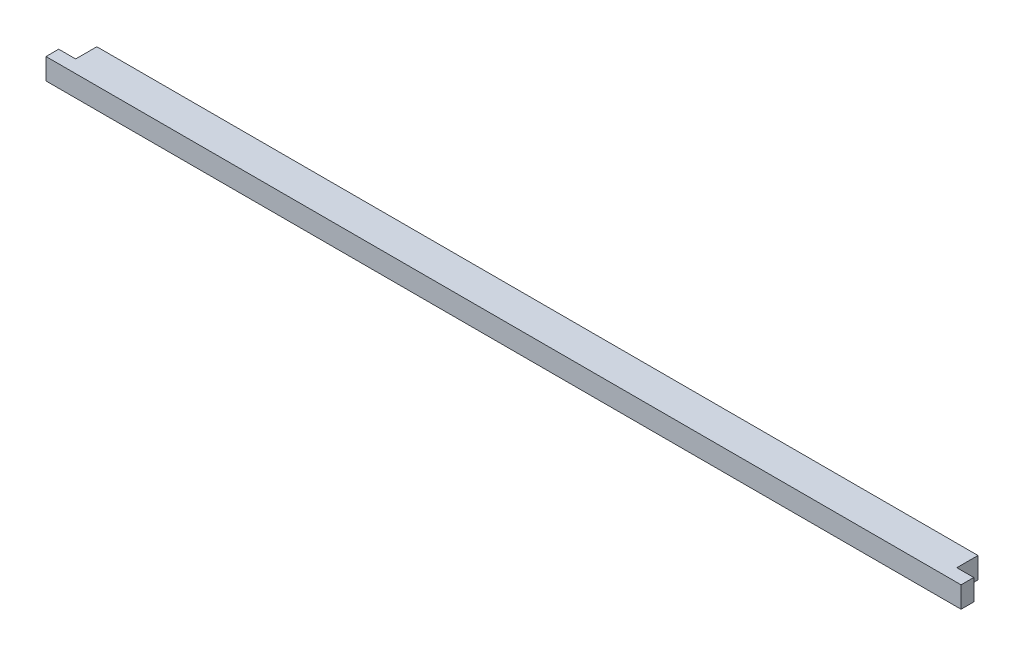
ISO-10303-21;
HEADER;
FILE_DESCRIPTION(('STEP AP214'),'2;1');
FILE_NAME('part.step','',(''),(''),'','','');
FILE_SCHEMA(('AUTOMOTIVE_DESIGN { 1 0 10303 214 1 1 1 1 }'));
ENDSEC;
DATA;
#1=APPLICATION_CONTEXT('core data for automotive mechanical design processes');
#2=APPLICATION_PROTOCOL_DEFINITION('international standard','automotive_design',2000,#1);
#3=PRODUCT_CONTEXT('',#1,'mechanical');
#4=PRODUCT('Part','Part','',(#3));
#5=PRODUCT_RELATED_PRODUCT_CATEGORY('part','',(#4));
#6=PRODUCT_DEFINITION_FORMATION('','',#4);
#7=PRODUCT_DEFINITION_CONTEXT('part definition',#1,'design');
#8=PRODUCT_DEFINITION('design','',#6,#7);
#9=PRODUCT_DEFINITION_SHAPE('','',#8);
#10=(LENGTH_UNIT() NAMED_UNIT(*) SI_UNIT(.MILLI.,.METRE.));
#11=(NAMED_UNIT(*) PLANE_ANGLE_UNIT() SI_UNIT($,.RADIAN.));
#12=(NAMED_UNIT(*) SI_UNIT($,.STERADIAN.) SOLID_ANGLE_UNIT());
#13=UNCERTAINTY_MEASURE_WITH_UNIT(LENGTH_MEASURE(1.E-05),#10,'distance_accuracy_value','');
#14=(GEOMETRIC_REPRESENTATION_CONTEXT(3) GLOBAL_UNCERTAINTY_ASSIGNED_CONTEXT((#13)) GLOBAL_UNIT_ASSIGNED_CONTEXT((#10,
#11,#12)) REPRESENTATION_CONTEXT('',''));
#15=CARTESIAN_POINT('',(0.,0.,0.));
#16=DIRECTION('',(0.,0.,1.));
#17=DIRECTION('',(1.,0.,0.));
#18=AXIS2_PLACEMENT_3D('',#15,#16,#17);
#19=CARTESIAN_POINT('',(0.,10.,-16.));
#20=DIRECTION('',(0.,0.,-1.));
#21=DIRECTION('',(-1.,0.,0.));
#22=AXIS2_PLACEMENT_3D('',#19,#20,#21);
#23=PLANE('',#22);
#24=DIRECTION('',(0.,1.,0.));
#25=VECTOR('',#24,1.);
#26=CARTESIAN_POINT('',(8.,0.,-16.));
#27=LINE('',#26,#25);
#28=CARTESIAN_POINT('',(8.,0.,-16.));
#29=VERTEX_POINT('',#28);
#30=CARTESIAN_POINT('',(8.,10.,-16.));
#31=VERTEX_POINT('',#30);
#32=EDGE_CURVE('E131',#29,#31,#27,.T.);
#33=ORIENTED_EDGE('',*,*,#32,.T.);
#34=DIRECTION('',(1.,0.,0.));
#35=VECTOR('',#34,1.);
#36=CARTESIAN_POINT('',(0.,10.,-16.));
#37=LINE('',#36,#35);
#38=CARTESIAN_POINT('',(424.,10.,-16.));
#39=VERTEX_POINT('',#38);
#40=EDGE_CURVE('E118',#31,#39,#37,.T.);
#41=ORIENTED_EDGE('',*,*,#40,.T.);
#42=DIRECTION('',(0.,1.,0.));
#43=VECTOR('',#42,1.);
#44=CARTESIAN_POINT('',(424.,0.,-16.));
#45=LINE('',#44,#43);
#46=CARTESIAN_POINT('',(424.,0.,-16.));
#47=VERTEX_POINT('',#46);
#48=EDGE_CURVE('E137',#47,#39,#45,.T.);
#49=ORIENTED_EDGE('',*,*,#48,.F.);
#50=DIRECTION('',(1.,0.,0.));
#51=VECTOR('',#50,1.);
#52=CARTESIAN_POINT('',(0.,0.,-16.));
#53=LINE('',#52,#51);
#54=EDGE_CURVE('E128',#29,#47,#53,.T.);
#55=ORIENTED_EDGE('',*,*,#54,.F.);
#56=EDGE_LOOP('',(#33,#41,#49,#55));
#57=FACE_BOUND('',#56,.T.);
#58=ADVANCED_FACE('F33',(#57),#23,.T.);
#59=CARTESIAN_POINT('',(0.,10.,0.));
#60=DIRECTION('',(-1.,0.,0.));
#61=DIRECTION('',(0.,0.,1.));
#62=AXIS2_PLACEMENT_3D('',#59,#60,#61);
#63=PLANE('',#62);
#64=DIRECTION('',(0.,1.,0.));
#65=VECTOR('',#64,1.);
#66=CARTESIAN_POINT('',(0.,0.,-6.));
#67=LINE('',#66,#65);
#68=CARTESIAN_POINT('',(0.,0.,-6.));
#69=VERTEX_POINT('',#68);
#70=CARTESIAN_POINT('',(0.,10.,-6.));
#71=VERTEX_POINT('',#70);
#72=EDGE_CURVE('E99',#69,#71,#67,.T.);
#73=ORIENTED_EDGE('',*,*,#72,.F.);
#74=DIRECTION('',(0.,0.,-1.));
#75=VECTOR('',#74,1.);
#76=CARTESIAN_POINT('',(0.,0.,0.));
#77=LINE('',#76,#75);
#78=CARTESIAN_POINT('',(0.,0.,0.));
#79=VERTEX_POINT('',#78);
#80=EDGE_CURVE('E110',#79,#69,#77,.T.);
#81=ORIENTED_EDGE('',*,*,#80,.F.);
#82=DIRECTION('',(0.,-1.,0.));
#83=VECTOR('',#82,1.);
#84=CARTESIAN_POINT('',(0.,10.,0.));
#85=LINE('',#84,#83);
#86=CARTESIAN_POINT('',(0.,10.,0.));
#87=VERTEX_POINT('',#86);
#88=EDGE_CURVE('E11',#87,#79,#85,.T.);
#89=ORIENTED_EDGE('',*,*,#88,.F.);
#90=DIRECTION('',(0.,0.,-1.));
#91=VECTOR('',#90,1.);
#92=CARTESIAN_POINT('',(0.,10.,0.));
#93=LINE('',#92,#91);
#94=EDGE_CURVE('E112',#87,#71,#93,.T.);
#95=ORIENTED_EDGE('',*,*,#94,.T.);
#96=EDGE_LOOP('',(#73,#81,#89,#95));
#97=FACE_BOUND('',#96,.T.);
#98=ADVANCED_FACE('F109',(#97),#63,.T.);
#99=CARTESIAN_POINT('',(0.,10.,0.));
#100=DIRECTION('',(0.,0.,-1.));
#101=DIRECTION('',(-1.,0.,0.));
#102=AXIS2_PLACEMENT_3D('',#99,#100,#101);
#103=PLANE('',#102);
#104=DIRECTION('',(1.,0.,0.));
#105=VECTOR('',#104,1.);
#106=CARTESIAN_POINT('',(0.,0.,0.));
#107=LINE('',#106,#105);
#108=CARTESIAN_POINT('',(432.,0.,0.));
#109=VERTEX_POINT('',#108);
#110=EDGE_CURVE('E117',#79,#109,#107,.T.);
#111=ORIENTED_EDGE('',*,*,#110,.T.);
#112=DIRECTION('',(0.,-1.,0.));
#113=VECTOR('',#112,1.);
#114=CARTESIAN_POINT('',(432.,10.,0.));
#115=LINE('',#114,#113);
#116=CARTESIAN_POINT('',(432.,10.,0.));
#117=VERTEX_POINT('',#116);
#118=EDGE_CURVE('E36',#117,#109,#115,.T.);
#119=ORIENTED_EDGE('',*,*,#118,.F.);
#120=DIRECTION('',(1.,0.,0.));
#121=VECTOR('',#120,1.);
#122=CARTESIAN_POINT('',(0.,10.,0.));
#123=LINE('',#122,#121);
#124=EDGE_CURVE('E133',#87,#117,#123,.T.);
#125=ORIENTED_EDGE('',*,*,#124,.F.);
#126=ORIENTED_EDGE('',*,*,#88,.T.);
#127=EDGE_LOOP('',(#111,#119,#125,#126));
#128=FACE_BOUND('',#127,.T.);
#129=ADVANCED_FACE('F178',(#128),#103,.F.);
#130=CARTESIAN_POINT('',(432.,10.,0.));
#131=DIRECTION('',(-1.,0.,0.));
#132=DIRECTION('',(0.,0.,1.));
#133=AXIS2_PLACEMENT_3D('',#130,#131,#132);
#134=PLANE('',#133);
#135=DIRECTION('',(0.,0.,-1.));
#136=VECTOR('',#135,1.);
#137=CARTESIAN_POINT('',(432.,0.,0.));
#138=LINE('',#137,#136);
#139=CARTESIAN_POINT('',(432.,0.,-6.));
#140=VERTEX_POINT('',#139);
#141=EDGE_CURVE('E123',#109,#140,#138,.T.);
#142=ORIENTED_EDGE('',*,*,#141,.T.);
#143=DIRECTION('',(0.,1.,0.));
#144=VECTOR('',#143,1.);
#145=CARTESIAN_POINT('',(432.,0.,-6.));
#146=LINE('',#145,#144);
#147=CARTESIAN_POINT('',(432.,10.,-6.));
#148=VERTEX_POINT('',#147);
#149=EDGE_CURVE('E141',#140,#148,#146,.T.);
#150=ORIENTED_EDGE('',*,*,#149,.T.);
#151=DIRECTION('',(0.,0.,-1.));
#152=VECTOR('',#151,1.);
#153=CARTESIAN_POINT('',(432.,10.,0.));
#154=LINE('',#153,#152);
#155=EDGE_CURVE('E121',#117,#148,#154,.T.);
#156=ORIENTED_EDGE('',*,*,#155,.F.);
#157=ORIENTED_EDGE('',*,*,#118,.T.);
#158=EDGE_LOOP('',(#142,#150,#156,#157));
#159=FACE_BOUND('',#158,.T.);
#160=ADVANCED_FACE('F173',(#159),#134,.F.);
#161=CARTESIAN_POINT('',(0.,10.,0.));
#162=DIRECTION('',(0.,1.,0.));
#163=DIRECTION('',(0.,0.,1.));
#164=AXIS2_PLACEMENT_3D('',#161,#162,#163);
#165=PLANE('',#164);
#166=DIRECTION('',(0.,0.,-1.));
#167=VECTOR('',#166,1.);
#168=CARTESIAN_POINT('',(8.,10.,-16.));
#169=LINE('',#168,#167);
#170=CARTESIAN_POINT('',(8.,10.,-6.));
#171=VERTEX_POINT('',#170);
#172=EDGE_CURVE('E104',#171,#31,#169,.T.);
#173=ORIENTED_EDGE('',*,*,#172,.F.);
#174=DIRECTION('',(1.,0.,0.));
#175=VECTOR('',#174,1.);
#176=CARTESIAN_POINT('',(0.,10.,-6.));
#177=LINE('',#176,#175);
#178=EDGE_CURVE('E144',#71,#171,#177,.T.);
#179=ORIENTED_EDGE('',*,*,#178,.F.);
#180=ORIENTED_EDGE('',*,*,#94,.F.);
#181=ORIENTED_EDGE('',*,*,#124,.T.);
#182=ORIENTED_EDGE('',*,*,#155,.T.);
#183=DIRECTION('',(1.,0.,0.));
#184=VECTOR('',#183,1.);
#185=CARTESIAN_POINT('',(424.,10.,-6.));
#186=LINE('',#185,#184);
#187=CARTESIAN_POINT('',(424.,10.,-6.));
#188=VERTEX_POINT('',#187);
#189=EDGE_CURVE('E145',#188,#148,#186,.T.);
#190=ORIENTED_EDGE('',*,*,#189,.F.);
#191=DIRECTION('',(0.,0.,1.));
#192=VECTOR('',#191,1.);
#193=CARTESIAN_POINT('',(424.,10.,-16.));
#194=LINE('',#193,#192);
#195=EDGE_CURVE('E148',#39,#188,#194,.T.);
#196=ORIENTED_EDGE('',*,*,#195,.F.);
#197=ORIENTED_EDGE('',*,*,#40,.F.);
#198=EDGE_LOOP('',(#173,#179,#180,#181,#182,#190,#196,#197));
#199=FACE_BOUND('',#198,.T.);
#200=ADVANCED_FACE('F169',(#199),#165,.T.);
#201=CARTESIAN_POINT('',(0.,0.,0.));
#202=DIRECTION('',(0.,1.,0.));
#203=DIRECTION('',(0.,0.,1.));
#204=AXIS2_PLACEMENT_3D('',#201,#202,#203);
#205=PLANE('',#204);
#206=DIRECTION('',(1.,0.,0.));
#207=VECTOR('',#206,1.);
#208=CARTESIAN_POINT('',(0.,0.,-6.));
#209=LINE('',#208,#207);
#210=CARTESIAN_POINT('',(8.,0.,-6.));
#211=VERTEX_POINT('',#210);
#212=EDGE_CURVE('E95',#69,#211,#209,.T.);
#213=ORIENTED_EDGE('',*,*,#212,.T.);
#214=DIRECTION('',(0.,0.,-1.));
#215=VECTOR('',#214,1.);
#216=CARTESIAN_POINT('',(8.,0.,-16.));
#217=LINE('',#216,#215);
#218=EDGE_CURVE('E47',#211,#29,#217,.T.);
#219=ORIENTED_EDGE('',*,*,#218,.T.);
#220=ORIENTED_EDGE('',*,*,#54,.T.);
#221=DIRECTION('',(0.,0.,1.));
#222=VECTOR('',#221,1.);
#223=CARTESIAN_POINT('',(424.,0.,-16.));
#224=LINE('',#223,#222);
#225=CARTESIAN_POINT('',(424.,0.,-6.));
#226=VERTEX_POINT('',#225);
#227=EDGE_CURVE('E147',#47,#226,#224,.T.);
#228=ORIENTED_EDGE('',*,*,#227,.T.);
#229=DIRECTION('',(1.,0.,0.));
#230=VECTOR('',#229,1.);
#231=CARTESIAN_POINT('',(424.,0.,-6.));
#232=LINE('',#231,#230);
#233=EDGE_CURVE('E55',#226,#140,#232,.T.);
#234=ORIENTED_EDGE('',*,*,#233,.T.);
#235=ORIENTED_EDGE('',*,*,#141,.F.);
#236=ORIENTED_EDGE('',*,*,#110,.F.);
#237=ORIENTED_EDGE('',*,*,#80,.T.);
#238=EDGE_LOOP('',(#213,#219,#220,#228,#234,#235,#236,#237));
#239=FACE_BOUND('',#238,.T.);
#240=ADVANCED_FACE('F115',(#239),#205,.F.);
#241=CARTESIAN_POINT('',(424.,0.,-6.));
#242=DIRECTION('',(0.,0.,1.));
#243=DIRECTION('',(1.,0.,0.));
#244=AXIS2_PLACEMENT_3D('',#241,#242,#243);
#245=PLANE('',#244);
#246=ORIENTED_EDGE('',*,*,#189,.T.);
#247=ORIENTED_EDGE('',*,*,#149,.F.);
#248=ORIENTED_EDGE('',*,*,#233,.F.);
#249=DIRECTION('',(0.,1.,0.));
#250=VECTOR('',#249,1.);
#251=CARTESIAN_POINT('',(424.,0.,-6.));
#252=LINE('',#251,#250);
#253=EDGE_CURVE('E139',#226,#188,#252,.T.);
#254=ORIENTED_EDGE('',*,*,#253,.T.);
#255=EDGE_LOOP('',(#246,#247,#248,#254));
#256=FACE_BOUND('',#255,.T.);
#257=ADVANCED_FACE('F171',(#256),#245,.F.);
#258=CARTESIAN_POINT('',(424.,0.,-16.));
#259=DIRECTION('',(-1.,0.,0.));
#260=DIRECTION('',(0.,0.,1.));
#261=AXIS2_PLACEMENT_3D('',#258,#259,#260);
#262=PLANE('',#261);
#263=ORIENTED_EDGE('',*,*,#195,.T.);
#264=ORIENTED_EDGE('',*,*,#253,.F.);
#265=ORIENTED_EDGE('',*,*,#227,.F.);
#266=ORIENTED_EDGE('',*,*,#48,.T.);
#267=EDGE_LOOP('',(#263,#264,#265,#266));
#268=FACE_BOUND('',#267,.T.);
#269=ADVANCED_FACE('F165',(#268),#262,.F.);
#270=CARTESIAN_POINT('',(8.,0.,-16.));
#271=DIRECTION('',(1.,0.,0.));
#272=DIRECTION('',(0.,0.,-1.));
#273=AXIS2_PLACEMENT_3D('',#270,#271,#272);
#274=PLANE('',#273);
#275=ORIENTED_EDGE('',*,*,#172,.T.);
#276=ORIENTED_EDGE('',*,*,#32,.F.);
#277=ORIENTED_EDGE('',*,*,#218,.F.);
#278=DIRECTION('',(0.,1.,0.));
#279=VECTOR('',#278,1.);
#280=CARTESIAN_POINT('',(8.,0.,-6.));
#281=LINE('',#280,#279);
#282=EDGE_CURVE('E101',#211,#171,#281,.T.);
#283=ORIENTED_EDGE('',*,*,#282,.T.);
#284=EDGE_LOOP('',(#275,#276,#277,#283));
#285=FACE_BOUND('',#284,.T.);
#286=ADVANCED_FACE('F179',(#285),#274,.F.);
#287=CARTESIAN_POINT('',(0.,0.,-6.));
#288=DIRECTION('',(0.,0.,1.));
#289=DIRECTION('',(1.,0.,0.));
#290=AXIS2_PLACEMENT_3D('',#287,#288,#289);
#291=PLANE('',#290);
#292=ORIENTED_EDGE('',*,*,#178,.T.);
#293=ORIENTED_EDGE('',*,*,#282,.F.);
#294=ORIENTED_EDGE('',*,*,#212,.F.);
#295=ORIENTED_EDGE('',*,*,#72,.T.);
#296=EDGE_LOOP('',(#292,#293,#294,#295));
#297=FACE_BOUND('',#296,.T.);
#298=ADVANCED_FACE('F98',(#297),#291,.F.);
#299=CLOSED_SHELL('',(#58,#98,#129,#160,#200,#240,#257,#269,#286,#298));
#300=MANIFOLD_SOLID_BREP('B2',#299);
#301=ADVANCED_BREP_SHAPE_REPRESENTATION('',(#18,#300),#14);
#302=SHAPE_DEFINITION_REPRESENTATION(#9,#301);
ENDSEC;
END-ISO-10303-21;
